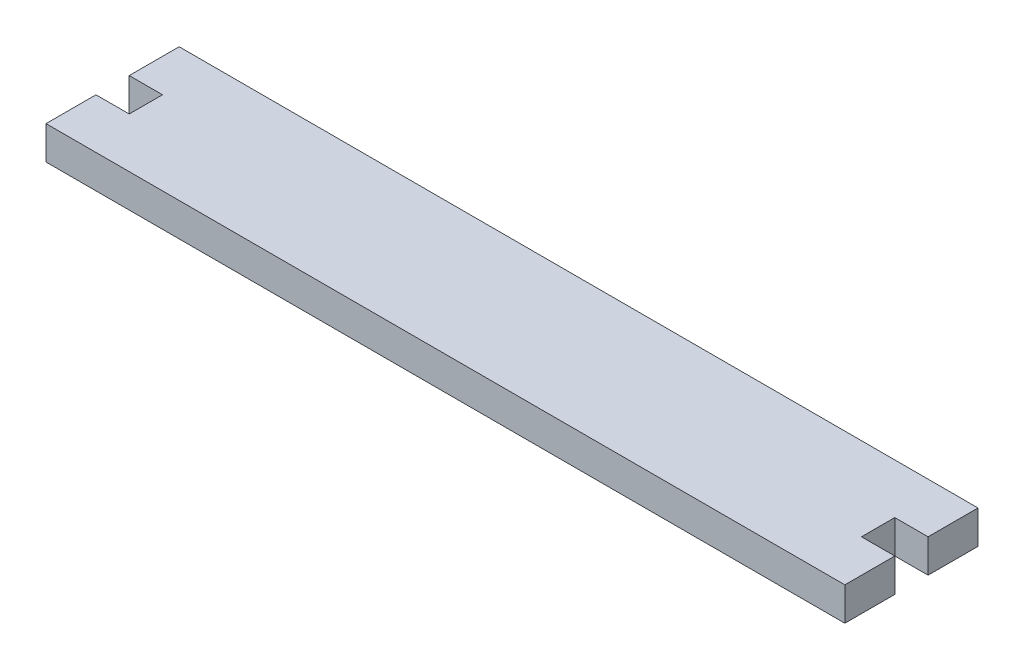
ISO-10303-21;
HEADER;
FILE_DESCRIPTION(('STEP AP214'),'2;1');
FILE_NAME('part.step','',(''),(''),'','','');
FILE_SCHEMA(('AUTOMOTIVE_DESIGN { 1 0 10303 214 1 1 1 1 }'));
ENDSEC;
DATA;
#1=APPLICATION_CONTEXT('core data for automotive mechanical design processes');
#2=APPLICATION_PROTOCOL_DEFINITION('international standard','automotive_design',2000,#1);
#3=PRODUCT_CONTEXT('',#1,'mechanical');
#4=PRODUCT('Part','Part','',(#3));
#5=PRODUCT_RELATED_PRODUCT_CATEGORY('part','',(#4));
#6=PRODUCT_DEFINITION_FORMATION('','',#4);
#7=PRODUCT_DEFINITION_CONTEXT('part definition',#1,'design');
#8=PRODUCT_DEFINITION('design','',#6,#7);
#9=PRODUCT_DEFINITION_SHAPE('','',#8);
#10=(LENGTH_UNIT() NAMED_UNIT(*) SI_UNIT(.MILLI.,.METRE.));
#11=(NAMED_UNIT(*) PLANE_ANGLE_UNIT() SI_UNIT($,.RADIAN.));
#12=(NAMED_UNIT(*) SI_UNIT($,.STERADIAN.) SOLID_ANGLE_UNIT());
#13=UNCERTAINTY_MEASURE_WITH_UNIT(LENGTH_MEASURE(1.E-05),#10,'distance_accuracy_value','');
#14=(GEOMETRIC_REPRESENTATION_CONTEXT(3) GLOBAL_UNCERTAINTY_ASSIGNED_CONTEXT((#13)) GLOBAL_UNIT_ASSIGNED_CONTEXT((#10,
#11,#12)) REPRESENTATION_CONTEXT('',''));
#15=CARTESIAN_POINT('',(0.,0.,0.));
#16=DIRECTION('',(0.,0.,1.));
#17=DIRECTION('',(1.,0.,0.));
#18=AXIS2_PLACEMENT_3D('',#15,#16,#17);
#19=CARTESIAN_POINT('',(34.925,3.175,1.5875));
#20=DIRECTION('',(0.,0.,-1.));
#21=DIRECTION('',(-1.,0.,0.));
#22=AXIS2_PLACEMENT_3D('',#19,#20,#21);
#23=PLANE('',#22);
#24=DIRECTION('',(1.,0.,0.));
#25=VECTOR('',#24,1.);
#26=CARTESIAN_POINT('',(34.925,0.,1.5875));
#27=LINE('',#26,#25);
#28=CARTESIAN_POINT('',(34.925,0.,1.5875));
#29=VERTEX_POINT('',#28);
#30=CARTESIAN_POINT('',(38.1,0.,1.5875));
#31=VERTEX_POINT('',#30);
#32=EDGE_CURVE('E155',#29,#31,#27,.T.);
#33=ORIENTED_EDGE('',*,*,#32,.F.);
#34=DIRECTION('',(0.,-1.,0.));
#35=VECTOR('',#34,1.);
#36=CARTESIAN_POINT('',(34.925,3.175,1.5875));
#37=LINE('',#36,#35);
#38=CARTESIAN_POINT('',(34.925,3.175,1.5875));
#39=VERTEX_POINT('',#38);
#40=EDGE_CURVE('E11',#39,#29,#37,.T.);
#41=ORIENTED_EDGE('',*,*,#40,.F.);
#42=DIRECTION('',(1.,0.,0.));
#43=VECTOR('',#42,1.);
#44=CARTESIAN_POINT('',(34.925,3.175,1.5875));
#45=LINE('',#44,#43);
#46=CARTESIAN_POINT('',(38.1,3.175,1.5875));
#47=VERTEX_POINT('',#46);
#48=EDGE_CURVE('E182',#39,#47,#45,.T.);
#49=ORIENTED_EDGE('',*,*,#48,.T.);
#50=DIRECTION('',(0.,-1.,0.));
#51=VECTOR('',#50,1.);
#52=CARTESIAN_POINT('',(38.1,3.175,1.5875));
#53=LINE('',#52,#51);
#54=EDGE_CURVE('E38',#47,#31,#53,.T.);
#55=ORIENTED_EDGE('',*,*,#54,.T.);
#56=EDGE_LOOP('',(#33,#41,#49,#55));
#57=FACE_BOUND('',#56,.T.);
#58=ADVANCED_FACE('F35',(#57),#23,.T.);
#59=CARTESIAN_POINT('',(34.925,3.175,-1.5875));
#60=DIRECTION('',(1.,0.,0.));
#61=DIRECTION('',(0.,0.,-1.));
#62=AXIS2_PLACEMENT_3D('',#59,#60,#61);
#63=PLANE('',#62);
#64=DIRECTION('',(0.,0.,1.));
#65=VECTOR('',#64,1.);
#66=CARTESIAN_POINT('',(34.925,0.,-1.5875));
#67=LINE('',#66,#65);
#68=CARTESIAN_POINT('',(34.925,0.,-1.5875));
#69=VERTEX_POINT('',#68);
#70=EDGE_CURVE('E180',#69,#29,#67,.T.);
#71=ORIENTED_EDGE('',*,*,#70,.F.);
#72=DIRECTION('',(0.,-1.,0.));
#73=VECTOR('',#72,1.);
#74=CARTESIAN_POINT('',(34.925,3.175,-1.5875));
#75=LINE('',#74,#73);
#76=CARTESIAN_POINT('',(34.925,3.175,-1.5875));
#77=VERTEX_POINT('',#76);
#78=EDGE_CURVE('E44',#77,#69,#75,.T.);
#79=ORIENTED_EDGE('',*,*,#78,.F.);
#80=DIRECTION('',(0.,0.,1.));
#81=VECTOR('',#80,1.);
#82=CARTESIAN_POINT('',(34.925,3.175,-1.5875));
#83=LINE('',#82,#81);
#84=EDGE_CURVE('E144',#77,#39,#83,.T.);
#85=ORIENTED_EDGE('',*,*,#84,.T.);
#86=ORIENTED_EDGE('',*,*,#40,.T.);
#87=EDGE_LOOP('',(#71,#79,#85,#86));
#88=FACE_BOUND('',#87,.T.);
#89=ADVANCED_FACE('F207',(#88),#63,.T.);
#90=CARTESIAN_POINT('',(38.1,3.175,-1.5875));
#91=DIRECTION('',(0.,0.,1.));
#92=DIRECTION('',(1.,0.,0.));
#93=AXIS2_PLACEMENT_3D('',#90,#91,#92);
#94=PLANE('',#93);
#95=DIRECTION('',(-1.,0.,0.));
#96=VECTOR('',#95,1.);
#97=CARTESIAN_POINT('',(38.1,0.,-1.5875));
#98=LINE('',#97,#96);
#99=CARTESIAN_POINT('',(38.1,0.,-1.5875));
#100=VERTEX_POINT('',#99);
#101=EDGE_CURVE('E133',#100,#69,#98,.T.);
#102=ORIENTED_EDGE('',*,*,#101,.F.);
#103=DIRECTION('',(0.,-1.,0.));
#104=VECTOR('',#103,1.);
#105=CARTESIAN_POINT('',(38.1,3.175,-1.5875));
#106=LINE('',#105,#104);
#107=CARTESIAN_POINT('',(38.1,3.175,-1.5875));
#108=VERTEX_POINT('',#107);
#109=EDGE_CURVE('E128',#108,#100,#106,.T.);
#110=ORIENTED_EDGE('',*,*,#109,.F.);
#111=DIRECTION('',(-1.,0.,0.));
#112=VECTOR('',#111,1.);
#113=CARTESIAN_POINT('',(38.1,3.175,-1.5875));
#114=LINE('',#113,#112);
#115=EDGE_CURVE('E131',#108,#77,#114,.T.);
#116=ORIENTED_EDGE('',*,*,#115,.T.);
#117=ORIENTED_EDGE('',*,*,#78,.T.);
#118=EDGE_LOOP('',(#102,#110,#116,#117));
#119=FACE_BOUND('',#118,.T.);
#120=ADVANCED_FACE('F130',(#119),#94,.T.);
#121=CARTESIAN_POINT('',(38.1,3.175,-6.35));
#122=DIRECTION('',(1.,0.,0.));
#123=DIRECTION('',(0.,0.,-1.));
#124=AXIS2_PLACEMENT_3D('',#121,#122,#123);
#125=PLANE('',#124);
#126=DIRECTION('',(0.,0.,1.));
#127=VECTOR('',#126,1.);
#128=CARTESIAN_POINT('',(38.1,0.,-6.35));
#129=LINE('',#128,#127);
#130=CARTESIAN_POINT('',(38.1,0.,-6.35));
#131=VERTEX_POINT('',#130);
#132=EDGE_CURVE('E177',#131,#100,#129,.T.);
#133=ORIENTED_EDGE('',*,*,#132,.F.);
#134=DIRECTION('',(0.,-1.,0.));
#135=VECTOR('',#134,1.);
#136=CARTESIAN_POINT('',(38.1,3.175,-6.35));
#137=LINE('',#136,#135);
#138=CARTESIAN_POINT('',(38.1,3.175,-6.35));
#139=VERTEX_POINT('',#138);
#140=EDGE_CURVE('E138',#139,#131,#137,.T.);
#141=ORIENTED_EDGE('',*,*,#140,.F.);
#142=DIRECTION('',(0.,0.,1.));
#143=VECTOR('',#142,1.);
#144=CARTESIAN_POINT('',(38.1,3.175,-6.35));
#145=LINE('',#144,#143);
#146=EDGE_CURVE('E143',#139,#108,#145,.T.);
#147=ORIENTED_EDGE('',*,*,#146,.T.);
#148=ORIENTED_EDGE('',*,*,#109,.T.);
#149=EDGE_LOOP('',(#133,#141,#147,#148));
#150=FACE_BOUND('',#149,.T.);
#151=ADVANCED_FACE('F146',(#150),#125,.T.);
#152=CARTESIAN_POINT('',(38.1,3.175,-6.35));
#153=DIRECTION('',(0.,0.,1.));
#154=DIRECTION('',(1.,0.,0.));
#155=AXIS2_PLACEMENT_3D('',#152,#153,#154);
#156=PLANE('',#155);
#157=DIRECTION('',(-1.,0.,0.));
#158=VECTOR('',#157,1.);
#159=CARTESIAN_POINT('',(38.1,0.,-6.35));
#160=LINE('',#159,#158);
#161=CARTESIAN_POINT('',(-38.1,0.,-6.34999999999999));
#162=VERTEX_POINT('',#161);
#163=EDGE_CURVE('E175',#131,#162,#160,.T.);
#164=ORIENTED_EDGE('',*,*,#163,.T.);
#165=DIRECTION('',(0.,-1.,0.));
#166=VECTOR('',#165,1.);
#167=CARTESIAN_POINT('',(-38.1,3.175,-6.34999999999999));
#168=LINE('',#167,#166);
#169=CARTESIAN_POINT('',(-38.1,3.175,-6.34999999999999));
#170=VERTEX_POINT('',#169);
#171=EDGE_CURVE('E186',#170,#162,#168,.T.);
#172=ORIENTED_EDGE('',*,*,#171,.F.);
#173=DIRECTION('',(-1.,0.,0.));
#174=VECTOR('',#173,1.);
#175=CARTESIAN_POINT('',(38.1,3.175,-6.35));
#176=LINE('',#175,#174);
#177=EDGE_CURVE('E148',#139,#170,#176,.T.);
#178=ORIENTED_EDGE('',*,*,#177,.F.);
#179=ORIENTED_EDGE('',*,*,#140,.T.);
#180=EDGE_LOOP('',(#164,#172,#178,#179));
#181=FACE_BOUND('',#180,.T.);
#182=ADVANCED_FACE('F220',(#181),#156,.F.);
#183=CARTESIAN_POINT('',(-38.1,3.175,-6.34999999999999));
#184=DIRECTION('',(1.,0.,0.));
#185=DIRECTION('',(0.,0.,-1.));
#186=AXIS2_PLACEMENT_3D('',#183,#184,#185);
#187=PLANE('',#186);
#188=DIRECTION('',(0.,0.,1.));
#189=VECTOR('',#188,1.);
#190=CARTESIAN_POINT('',(-38.1,0.,-6.34999999999999));
#191=LINE('',#190,#189);
#192=CARTESIAN_POINT('',(-38.1,0.,-1.5875));
#193=VERTEX_POINT('',#192);
#194=EDGE_CURVE('E173',#162,#193,#191,.T.);
#195=ORIENTED_EDGE('',*,*,#194,.T.);
#196=DIRECTION('',(0.,-1.,0.));
#197=VECTOR('',#196,1.);
#198=CARTESIAN_POINT('',(-38.1,3.175,-1.5875));
#199=LINE('',#198,#197);
#200=CARTESIAN_POINT('',(-38.1,3.175,-1.5875));
#201=VERTEX_POINT('',#200);
#202=EDGE_CURVE('E189',#201,#193,#199,.T.);
#203=ORIENTED_EDGE('',*,*,#202,.F.);
#204=DIRECTION('',(0.,0.,1.));
#205=VECTOR('',#204,1.);
#206=CARTESIAN_POINT('',(-38.1,3.175,-6.34999999999999));
#207=LINE('',#206,#205);
#208=EDGE_CURVE('E150',#170,#201,#207,.T.);
#209=ORIENTED_EDGE('',*,*,#208,.F.);
#210=ORIENTED_EDGE('',*,*,#171,.T.);
#211=EDGE_LOOP('',(#195,#203,#209,#210));
#212=FACE_BOUND('',#211,.T.);
#213=ADVANCED_FACE('F223',(#212),#187,.F.);
#214=CARTESIAN_POINT('',(-38.1,3.175,-1.5875));
#215=DIRECTION('',(0.,0.,-1.));
#216=DIRECTION('',(-1.,0.,0.));
#217=AXIS2_PLACEMENT_3D('',#214,#215,#216);
#218=PLANE('',#217);
#219=DIRECTION('',(1.,0.,0.));
#220=VECTOR('',#219,1.);
#221=CARTESIAN_POINT('',(-38.1,0.,-1.5875));
#222=LINE('',#221,#220);
#223=CARTESIAN_POINT('',(-34.925,0.,-1.5875));
#224=VERTEX_POINT('',#223);
#225=EDGE_CURVE('E171',#193,#224,#222,.T.);
#226=ORIENTED_EDGE('',*,*,#225,.T.);
#227=DIRECTION('',(0.,-1.,0.));
#228=VECTOR('',#227,1.);
#229=CARTESIAN_POINT('',(-34.925,3.175,-1.5875));
#230=LINE('',#229,#228);
#231=CARTESIAN_POINT('',(-34.925,3.175,-1.5875));
#232=VERTEX_POINT('',#231);
#233=EDGE_CURVE('E192',#232,#224,#230,.T.);
#234=ORIENTED_EDGE('',*,*,#233,.F.);
#235=DIRECTION('',(1.,0.,0.));
#236=VECTOR('',#235,1.);
#237=CARTESIAN_POINT('',(-38.1,3.175,-1.5875));
#238=LINE('',#237,#236);
#239=EDGE_CURVE('E352',#201,#232,#238,.T.);
#240=ORIENTED_EDGE('',*,*,#239,.F.);
#241=ORIENTED_EDGE('',*,*,#202,.T.);
#242=EDGE_LOOP('',(#226,#234,#240,#241));
#243=FACE_BOUND('',#242,.T.);
#244=ADVANCED_FACE('F227',(#243),#218,.F.);
#245=CARTESIAN_POINT('',(-34.925,3.175,-1.5875));
#246=DIRECTION('',(1.,0.,0.));
#247=DIRECTION('',(0.,0.,-1.));
#248=AXIS2_PLACEMENT_3D('',#245,#246,#247);
#249=PLANE('',#248);
#250=DIRECTION('',(0.,0.,1.));
#251=VECTOR('',#250,1.);
#252=CARTESIAN_POINT('',(-34.925,0.,-1.5875));
#253=LINE('',#252,#251);
#254=CARTESIAN_POINT('',(-34.925,0.,1.5875));
#255=VERTEX_POINT('',#254);
#256=EDGE_CURVE('E169',#224,#255,#253,.T.);
#257=ORIENTED_EDGE('',*,*,#256,.T.);
#258=DIRECTION('',(0.,-1.,0.));
#259=VECTOR('',#258,1.);
#260=CARTESIAN_POINT('',(-34.925,3.175,1.5875));
#261=LINE('',#260,#259);
#262=CARTESIAN_POINT('',(-34.925,3.175,1.5875));
#263=VERTEX_POINT('',#262);
#264=EDGE_CURVE('E195',#263,#255,#261,.T.);
#265=ORIENTED_EDGE('',*,*,#264,.F.);
#266=DIRECTION('',(0.,0.,1.));
#267=VECTOR('',#266,1.);
#268=CARTESIAN_POINT('',(-34.925,3.175,-1.5875));
#269=LINE('',#268,#267);
#270=EDGE_CURVE('E345',#232,#263,#269,.T.);
#271=ORIENTED_EDGE('',*,*,#270,.F.);
#272=ORIENTED_EDGE('',*,*,#233,.T.);
#273=EDGE_LOOP('',(#257,#265,#271,#272));
#274=FACE_BOUND('',#273,.T.);
#275=ADVANCED_FACE('F231',(#274),#249,.F.);
#276=CARTESIAN_POINT('',(-34.925,3.175,1.5875));
#277=DIRECTION('',(0.,0.,1.));
#278=DIRECTION('',(1.,0.,0.));
#279=AXIS2_PLACEMENT_3D('',#276,#277,#278);
#280=PLANE('',#279);
#281=DIRECTION('',(-1.,0.,0.));
#282=VECTOR('',#281,1.);
#283=CARTESIAN_POINT('',(-34.925,0.,1.5875));
#284=LINE('',#283,#282);
#285=CARTESIAN_POINT('',(-38.1,0.,1.5875));
#286=VERTEX_POINT('',#285);
#287=EDGE_CURVE('E167',#255,#286,#284,.T.);
#288=ORIENTED_EDGE('',*,*,#287,.T.);
#289=DIRECTION('',(0.,-1.,0.));
#290=VECTOR('',#289,1.);
#291=CARTESIAN_POINT('',(-38.1,3.175,1.5875));
#292=LINE('',#291,#290);
#293=CARTESIAN_POINT('',(-38.1,3.175,1.5875));
#294=VERTEX_POINT('',#293);
#295=EDGE_CURVE('E198',#294,#286,#292,.T.);
#296=ORIENTED_EDGE('',*,*,#295,.F.);
#297=DIRECTION('',(-1.,0.,0.));
#298=VECTOR('',#297,1.);
#299=CARTESIAN_POINT('',(-34.925,3.175,1.5875));
#300=LINE('',#299,#298);
#301=EDGE_CURVE('E342',#263,#294,#300,.T.);
#302=ORIENTED_EDGE('',*,*,#301,.F.);
#303=ORIENTED_EDGE('',*,*,#264,.T.);
#304=EDGE_LOOP('',(#288,#296,#302,#303));
#305=FACE_BOUND('',#304,.T.);
#306=ADVANCED_FACE('F235',(#305),#280,.F.);
#307=CARTESIAN_POINT('',(-38.1,3.175,1.5875));
#308=DIRECTION('',(1.,0.,0.));
#309=DIRECTION('',(0.,0.,-1.));
#310=AXIS2_PLACEMENT_3D('',#307,#308,#309);
#311=PLANE('',#310);
#312=DIRECTION('',(0.,0.,1.));
#313=VECTOR('',#312,1.);
#314=CARTESIAN_POINT('',(-38.1,0.,1.5875));
#315=LINE('',#314,#313);
#316=CARTESIAN_POINT('',(-38.1,0.,6.35));
#317=VERTEX_POINT('',#316);
#318=EDGE_CURVE('E164',#286,#317,#315,.T.);
#319=ORIENTED_EDGE('',*,*,#318,.T.);
#320=DIRECTION('',(0.,-1.,0.));
#321=VECTOR('',#320,1.);
#322=CARTESIAN_POINT('',(-38.1,3.175,6.35));
#323=LINE('',#322,#321);
#324=CARTESIAN_POINT('',(-38.1,3.175,6.35));
#325=VERTEX_POINT('',#324);
#326=EDGE_CURVE('E201',#325,#317,#323,.T.);
#327=ORIENTED_EDGE('',*,*,#326,.F.);
#328=DIRECTION('',(0.,0.,1.));
#329=VECTOR('',#328,1.);
#330=CARTESIAN_POINT('',(-38.1,3.175,1.5875));
#331=LINE('',#330,#329);
#332=EDGE_CURVE('E340',#294,#325,#331,.T.);
#333=ORIENTED_EDGE('',*,*,#332,.F.);
#334=ORIENTED_EDGE('',*,*,#295,.T.);
#335=EDGE_LOOP('',(#319,#327,#333,#334));
#336=FACE_BOUND('',#335,.T.);
#337=ADVANCED_FACE('F239',(#336),#311,.F.);
#338=CARTESIAN_POINT('',(38.1,3.175,6.35));
#339=DIRECTION('',(0.,0.,1.));
#340=DIRECTION('',(1.,0.,0.));
#341=AXIS2_PLACEMENT_3D('',#338,#339,#340);
#342=PLANE('',#341);
#343=DIRECTION('',(-1.,0.,0.));
#344=VECTOR('',#343,1.);
#345=CARTESIAN_POINT('',(38.1,0.,6.35));
#346=LINE('',#345,#344);
#347=CARTESIAN_POINT('',(38.1,0.,6.35));
#348=VERTEX_POINT('',#347);
#349=EDGE_CURVE('E161',#348,#317,#346,.T.);
#350=ORIENTED_EDGE('',*,*,#349,.F.);
#351=DIRECTION('',(0.,-1.,0.));
#352=VECTOR('',#351,1.);
#353=CARTESIAN_POINT('',(38.1,3.175,6.35));
#354=LINE('',#353,#352);
#355=CARTESIAN_POINT('',(38.1,3.175,6.35));
#356=VERTEX_POINT('',#355);
#357=EDGE_CURVE('E202',#356,#348,#354,.T.);
#358=ORIENTED_EDGE('',*,*,#357,.F.);
#359=DIRECTION('',(-1.,0.,0.));
#360=VECTOR('',#359,1.);
#361=CARTESIAN_POINT('',(38.1,3.175,6.35));
#362=LINE('',#361,#360);
#363=EDGE_CURVE('E360',#356,#325,#362,.T.);
#364=ORIENTED_EDGE('',*,*,#363,.T.);
#365=ORIENTED_EDGE('',*,*,#326,.T.);
#366=EDGE_LOOP('',(#350,#358,#364,#365));
#367=FACE_BOUND('',#366,.T.);
#368=ADVANCED_FACE('F243',(#367),#342,.T.);
#369=CARTESIAN_POINT('',(38.1,3.175,1.5875));
#370=DIRECTION('',(1.,0.,0.));
#371=DIRECTION('',(0.,0.,-1.));
#372=AXIS2_PLACEMENT_3D('',#369,#370,#371);
#373=PLANE('',#372);
#374=DIRECTION('',(0.,0.,1.));
#375=VECTOR('',#374,1.);
#376=CARTESIAN_POINT('',(38.1,0.,1.5875));
#377=LINE('',#376,#375);
#378=EDGE_CURVE('E158',#31,#348,#377,.T.);
#379=ORIENTED_EDGE('',*,*,#378,.F.);
#380=ORIENTED_EDGE('',*,*,#54,.F.);
#381=DIRECTION('',(0.,0.,1.));
#382=VECTOR('',#381,1.);
#383=CARTESIAN_POINT('',(38.1,3.175,1.5875));
#384=LINE('',#383,#382);
#385=EDGE_CURVE('E362',#47,#356,#384,.T.);
#386=ORIENTED_EDGE('',*,*,#385,.T.);
#387=ORIENTED_EDGE('',*,*,#357,.T.);
#388=EDGE_LOOP('',(#379,#380,#386,#387));
#389=FACE_BOUND('',#388,.T.);
#390=ADVANCED_FACE('F204',(#389),#373,.T.);
#391=CARTESIAN_POINT('',(0.,3.175,0.));
#392=DIRECTION('',(0.,-1.,0.));
#393=DIRECTION('',(0.,0.,-1.));
#394=AXIS2_PLACEMENT_3D('',#391,#392,#393);
#395=PLANE('',#394);
#396=ORIENTED_EDGE('',*,*,#48,.F.);
#397=ORIENTED_EDGE('',*,*,#84,.F.);
#398=ORIENTED_EDGE('',*,*,#115,.F.);
#399=ORIENTED_EDGE('',*,*,#146,.F.);
#400=ORIENTED_EDGE('',*,*,#177,.T.);
#401=ORIENTED_EDGE('',*,*,#208,.T.);
#402=ORIENTED_EDGE('',*,*,#239,.T.);
#403=ORIENTED_EDGE('',*,*,#270,.T.);
#404=ORIENTED_EDGE('',*,*,#301,.T.);
#405=ORIENTED_EDGE('',*,*,#332,.T.);
#406=ORIENTED_EDGE('',*,*,#363,.F.);
#407=ORIENTED_EDGE('',*,*,#385,.F.);
#408=EDGE_LOOP('',(#396,#397,#398,#399,#400,#401,#402,#403,#404,#405,#406,#407));
#409=FACE_BOUND('',#408,.T.);
#410=ADVANCED_FACE('F142',(#409),#395,.F.);
#411=CARTESIAN_POINT('',(0.,0.,0.));
#412=DIRECTION('',(0.,-1.,0.));
#413=DIRECTION('',(0.,0.,-1.));
#414=AXIS2_PLACEMENT_3D('',#411,#412,#413);
#415=PLANE('',#414);
#416=ORIENTED_EDGE('',*,*,#32,.T.);
#417=ORIENTED_EDGE('',*,*,#378,.T.);
#418=ORIENTED_EDGE('',*,*,#349,.T.);
#419=ORIENTED_EDGE('',*,*,#318,.F.);
#420=ORIENTED_EDGE('',*,*,#287,.F.);
#421=ORIENTED_EDGE('',*,*,#256,.F.);
#422=ORIENTED_EDGE('',*,*,#225,.F.);
#423=ORIENTED_EDGE('',*,*,#194,.F.);
#424=ORIENTED_EDGE('',*,*,#163,.F.);
#425=ORIENTED_EDGE('',*,*,#132,.T.);
#426=ORIENTED_EDGE('',*,*,#101,.T.);
#427=ORIENTED_EDGE('',*,*,#70,.T.);
#428=EDGE_LOOP('',(#416,#417,#418,#419,#420,#421,#422,#423,#424,#425,#426,#427));
#429=FACE_BOUND('',#428,.T.);
#430=ADVANCED_FACE('F206',(#429),#415,.T.);
#431=CLOSED_SHELL('',(#58,#89,#120,#151,#182,#213,#244,#275,#306,#337,#368,#390,#410,#430));
#432=MANIFOLD_SOLID_BREP('B2',#431);
#433=ADVANCED_BREP_SHAPE_REPRESENTATION('',(#18,#432),#14);
#434=SHAPE_DEFINITION_REPRESENTATION(#9,#433);
ENDSEC;
END-ISO-10303-21;
